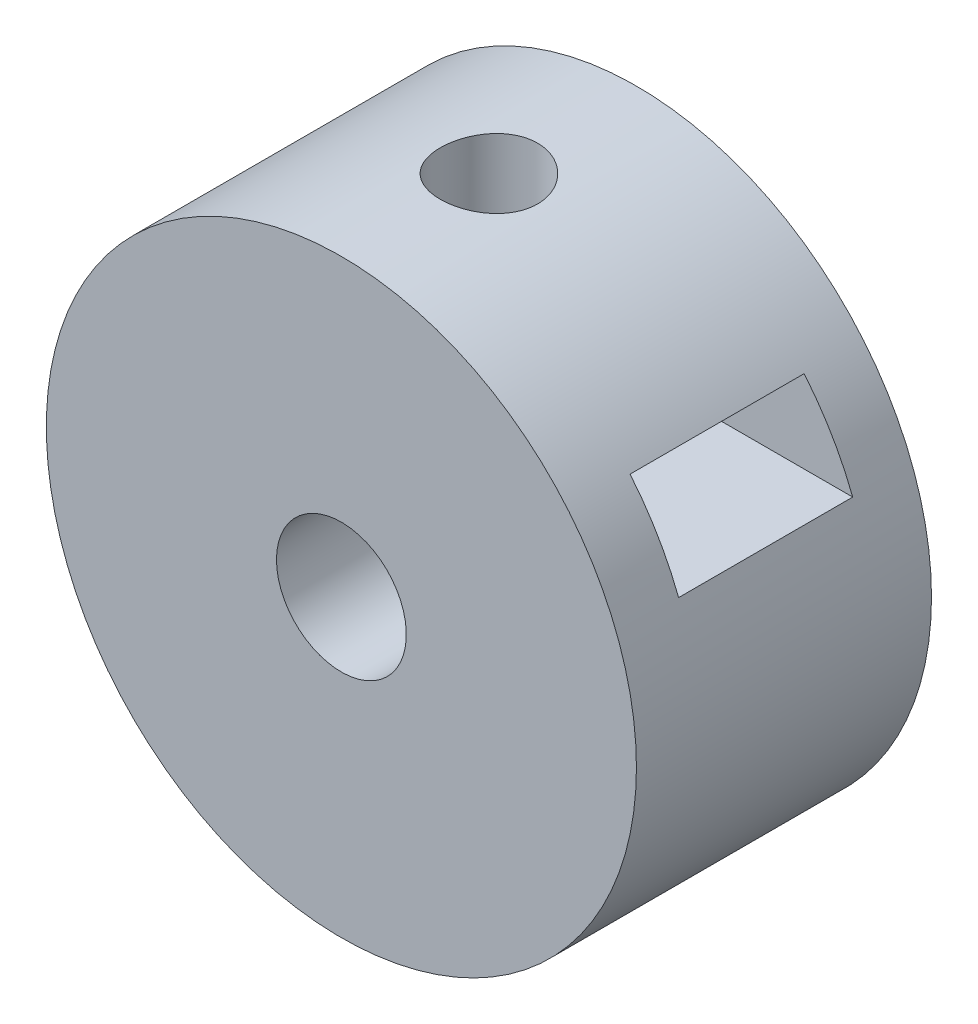
ISO-10303-21;
HEADER;
FILE_DESCRIPTION(('STEP AP214'),'2;1');
FILE_NAME('part.step','',(''),(''),'','','');
FILE_SCHEMA(('AUTOMOTIVE_DESIGN { 1 0 10303 214 1 1 1 1 }'));
ENDSEC;
DATA;
#1=APPLICATION_CONTEXT('core data for automotive mechanical design processes');
#2=APPLICATION_PROTOCOL_DEFINITION('international standard','automotive_design',2000,#1);
#3=PRODUCT_CONTEXT('',#1,'mechanical');
#4=PRODUCT('Part','Part','',(#3));
#5=PRODUCT_RELATED_PRODUCT_CATEGORY('part','',(#4));
#6=PRODUCT_DEFINITION_FORMATION('','',#4);
#7=PRODUCT_DEFINITION_CONTEXT('part definition',#1,'design');
#8=PRODUCT_DEFINITION('design','',#6,#7);
#9=PRODUCT_DEFINITION_SHAPE('','',#8);
#10=(LENGTH_UNIT() NAMED_UNIT(*) SI_UNIT(.MILLI.,.METRE.));
#11=(NAMED_UNIT(*) PLANE_ANGLE_UNIT() SI_UNIT($,.RADIAN.));
#12=(NAMED_UNIT(*) SI_UNIT($,.STERADIAN.) SOLID_ANGLE_UNIT());
#13=UNCERTAINTY_MEASURE_WITH_UNIT(LENGTH_MEASURE(1.E-05),#10,'distance_accuracy_value','');
#14=(GEOMETRIC_REPRESENTATION_CONTEXT(3) GLOBAL_UNCERTAINTY_ASSIGNED_CONTEXT((#13)) GLOBAL_UNIT_ASSIGNED_CONTEXT((#10,
#11,#12)) REPRESENTATION_CONTEXT('',''));
#15=CARTESIAN_POINT('',(0.,0.,0.));
#16=DIRECTION('',(0.,0.,1.));
#17=DIRECTION('',(1.,0.,0.));
#18=AXIS2_PLACEMENT_3D('',#15,#16,#17);
#19=CARTESIAN_POINT('',(0.,0.,5.));
#20=DIRECTION('',(0.,1.,0.));
#21=DIRECTION('',(0.,0.,1.));
#22=AXIS2_PLACEMENT_3D('',#19,#20,#21);
#23=CYLINDRICAL_SURFACE('',#22,1.65);
#24=CARTESIAN_POINT('',(0.,2.2,6.65));
#25=CARTESIAN_POINT('',(0.0805428094252697,2.19999494216035,6.64999472878678));
#26=CARTESIAN_POINT('',(0.161217168223634,2.19553010078902,6.64405447318806));
#27=CARTESIAN_POINT('',(0.320030035915114,2.17807268009191,6.62066623024883));
#28=CARTESIAN_POINT('',(0.398161649851905,2.16505866147839,6.60318931118494));
#29=CARTESIAN_POINT('',(0.549158089294374,2.13175242451666,6.55791579978785));
#30=CARTESIAN_POINT('',(0.622051776944111,2.1115044712521,6.53018193507391));
#31=CARTESIAN_POINT('',(0.761664569072828,2.06525612393863,6.46570342139405));
#32=CARTESIAN_POINT('',(0.828385471975966,2.03925741289032,6.42896140838713));
#33=CARTESIAN_POINT('',(0.960812531349159,1.98054498998381,6.3439106872501));
#34=CARTESIAN_POINT('',(1.02585255219924,1.94743239403283,6.29484593773252));
#35=CARTESIAN_POINT('',(1.14732988444438,1.87843719671715,6.18855457890271));
#36=CARTESIAN_POINT('',(1.20375363099448,1.8425503588647,6.13131536892019));
#37=CARTESIAN_POINT('',(1.31820877580285,1.76298236017189,5.9970587513938));
#38=CARTESIAN_POINT('',(1.37423636263325,1.71919940351103,5.91838595516613));
#39=CARTESIAN_POINT('',(1.47248197993983,1.63582589130548,5.7508038863968));
#40=CARTESIAN_POINT('',(1.51471888681385,1.59622965572043,5.66190883329966));
#41=CARTESIAN_POINT('',(1.57168690592967,1.53974870698196,5.50654687745614));
#42=CARTESIAN_POINT('',(1.59088241902193,1.51973526305407,5.44287023315878));
#43=CARTESIAN_POINT('',(1.62162739821328,1.48688753565754,5.31196799173659));
#44=CARTESIAN_POINT('',(1.63319436890794,1.47403682701915,5.24475090433773));
#45=CARTESIAN_POINT('',(1.6479410435559,1.45754135653008,5.10759915591616));
#46=CARTESIAN_POINT('',(1.65104450339628,1.45398029344257,5.03764551260354));
#47=CARTESIAN_POINT('',(1.64833034566056,1.45705484953675,4.89812359803027));
#48=CARTESIAN_POINT('',(1.64250952973084,1.46369412439925,4.82855547390382));
#49=CARTESIAN_POINT('',(1.6235751322107,1.48464385588771,4.69948951783163));
#50=CARTESIAN_POINT('',(1.61130735018899,1.49805872765858,4.6397099918492));
#51=CARTESIAN_POINT('',(1.58076238232806,1.53025612129433,4.52321723340704));
#52=CARTESIAN_POINT('',(1.5624794204929,1.54904380004846,4.46650700939405));
#53=CARTESIAN_POINT('',(1.50736370589788,1.60315946223737,4.32211797470244));
#54=CARTESIAN_POINT('',(1.46608163343378,1.64148214053156,4.23725954169214));
#55=CARTESIAN_POINT('',(1.37079825645971,1.72186627959715,4.07688382374401));
#56=CARTESIAN_POINT('',(1.31676604681466,1.7639366677472,4.00138992681988));
#57=CARTESIAN_POINT('',(1.19516764512349,1.84856839544459,3.85847127055598));
#58=CARTESIAN_POINT('',(1.1272951307864,1.89111545403263,3.79129733243037));
#59=CARTESIAN_POINT('',(0.979464773880551,1.9717284177907,3.66870998854072));
#60=CARTESIAN_POINT('',(0.899530559723135,2.00980283090136,3.61327408774659));
#61=CARTESIAN_POINT('',(0.74569228849956,2.07107698681007,3.52602112083563));
#62=CARTESIAN_POINT('',(0.673793857204186,2.09572848039509,3.49169694636264));
#63=CARTESIAN_POINT('',(0.523987390522299,2.13810194858642,3.43335263148975));
#64=CARTESIAN_POINT('',(0.446083155170146,2.15582826254787,3.40932603765079));
#65=CARTESIAN_POINT('',(0.285643855731874,2.18290147499588,3.37282130082492));
#66=CARTESIAN_POINT('',(0.20308340954654,2.19219652268924,3.36041460316751));
#67=CARTESIAN_POINT('',(0.0365213637766122,2.20127472025389,3.34829544289112));
#68=CARTESIAN_POINT('',(-0.0474796128099926,2.20106188329949,3.3485776244351));
#69=CARTESIAN_POINT('',(-0.205484639062585,2.19166801893461,3.36112195620051));
#70=CARTESIAN_POINT('',(-0.279644560300743,2.18339095260441,3.37217659057754));
#71=CARTESIAN_POINT('',(-0.424721737670026,2.15986452221747,3.40387115800865));
#72=CARTESIAN_POINT('',(-0.495638300285984,2.14461367457988,3.42451313065835));
#73=CARTESIAN_POINT('',(-0.635158457658743,2.10759813751645,3.47527628365241));
#74=CARTESIAN_POINT('',(-0.70359208978975,2.08562255319213,3.50570629957013));
#75=CARTESIAN_POINT('',(-0.834370379747377,2.03683683953159,3.57458970096815));
#76=CARTESIAN_POINT('',(-0.896714193470041,2.01002604145274,3.61304419640371));
#77=CARTESIAN_POINT('',(-1.02466278895094,1.94831061575149,3.70396157105162));
#78=CARTESIAN_POINT('',(-1.08907343896857,1.91280204527541,3.7576913933812));
#79=CARTESIAN_POINT('',(-1.20859172341439,1.83962848162263,3.87360962784722));
#80=CARTESIAN_POINT('',(-1.26367813516534,1.80195882358135,3.93581676966269));
#81=CARTESIAN_POINT('',(-1.37365295183189,1.72006041120646,4.08056486905729));
#82=CARTESIAN_POINT('',(-1.42651348013575,1.67594590372111,4.16472331764153));
#83=CARTESIAN_POINT('',(-1.51715559598111,1.59434650483296,4.34369608576969));
#84=CARTESIAN_POINT('',(-1.55498200567071,1.55684209528066,4.43847763409943));
#85=CARTESIAN_POINT('',(-1.60177307682444,1.50830765589441,4.59895589376192));
#86=CARTESIAN_POINT('',(-1.61624110464295,1.49265393007021,4.66163023904262));
#87=CARTESIAN_POINT('',(-1.63780674400097,1.46896261713312,4.7895777516815));
#88=CARTESIAN_POINT('',(-1.64492080719164,1.46090803342256,4.85484477748247));
#89=CARTESIAN_POINT('',(-1.65126852229971,1.4537336197143,4.98661198779246));
#90=CARTESIAN_POINT('',(-1.65046216857788,1.45465914753473,5.05311673731052));
#91=CARTESIAN_POINT('',(-1.64094572222041,1.46538093398033,5.18486252262737));
#92=CARTESIAN_POINT('',(-1.63222543027043,1.47518863973232,5.25010181668698));
#93=CARTESIAN_POINT('',(-1.60483226001695,1.5049908367755,5.39150602855188));
#94=CARTESIAN_POINT('',(-1.58440224749523,1.52674176545708,5.46694689814605));
#95=CARTESIAN_POINT('',(-1.53416589992731,1.57721259723951,5.61218833371353));
#96=CARTESIAN_POINT('',(-1.50433588027503,1.60595006161623,5.681974086242));
#97=CARTESIAN_POINT('',(-1.42448810827007,1.67768125061706,5.83877269353496));
#98=CARTESIAN_POINT('',(-1.37105696272568,1.72216223510215,5.92336374103133));
#99=CARTESIAN_POINT('',(-1.2501579031253,1.811848611994,6.08143864947532));
#100=CARTESIAN_POINT('',(-1.18267748234435,1.85705461649645,6.15491251253933));
#101=CARTESIAN_POINT('',(-1.03358985943168,1.94401887833773,6.29011502651166));
#102=CARTESIAN_POINT('',(-0.95187087771915,1.98574567082179,6.35174195131491));
#103=CARTESIAN_POINT('',(-0.775675008829828,2.06093018634906,6.45994535625988));
#104=CARTESIAN_POINT('',(-0.681229362441978,2.09440760752254,6.50655777202975));
#105=CARTESIAN_POINT('',(-0.511324319392104,2.14100375086452,6.57057936308428));
#106=CARTESIAN_POINT('',(-0.43840897625221,2.1572135474969,6.59254340451379));
#107=CARTESIAN_POINT('',(-0.28912577143204,2.18222113967261,6.62625969287264));
#108=CARTESIAN_POINT('',(-0.2127681862184,2.19103963331983,6.63804045927496));
#109=CARTESIAN_POINT('',(-0.113259640848082,2.1972001887694,6.64626516363578));
#110=CARTESIAN_POINT('',(-0.0906476405935391,2.19824837575288,6.64766390523836));
#111=CARTESIAN_POINT('',(-0.0453605785868176,2.19964904965452,6.64953214055407));
#112=CARTESIAN_POINT('',(-0.0226855072712277,2.20000142457979,6.65000148467811));
#113=CARTESIAN_POINT('',(0.,2.2,6.65));
#114=B_SPLINE_CURVE_WITH_KNOTS('',3,(#24,#25,#26,#27,#28,#29,#30,#31,#32,#33,#34,#35,#36,#37,
#38,#39,#40,#41,#42,#43,#44,#45,#46,#47,#48,#49,#50,#51,#52,#53,#54,#55,#56,#57,#58,#59,#60,#61,
#62,#63,#64,#65,#66,#67,#68,#69,#70,#71,#72,#73,#74,#75,#76,#77,#78,#79,#80,#81,#82,#83,#84,#85,
#86,#87,#88,#89,#90,#91,#92,#93,#94,#95,#96,#97,#98,#99,#100,#101,#102,#103,#104,#105,#106,#107,
#108,#109,#110,#111,#112,#113),.UNSPECIFIED.,.T.,.F.,(4,2,2,2,2,2,2,2,2,2,2,2,2,2,2,2,2,2,2,2,2,
2,2,2,2,2,2,2,2,2,2,2,2,2,2,2,2,2,2,2,2,2,2,2,4),(0.,0.241528965229246,0.483665951365568,
0.72434596693072,0.964955638734223,1.22784674449173,1.49114755245679,1.80796017476196,
2.12433731462157,2.33199470382892,2.53917392514819,2.74821346383382,2.9573279373023,
3.14409579178979,3.33104351360703,3.63494264986501,3.93958611593678,4.25189472331899,
4.5635992874306,4.81279155507028,5.06182742607429,5.31238463983588,5.56283609713275,
5.78810305713193,6.01341796204393,6.24668483432048,6.47998399375295,6.75224420290054,
7.02511599883997,7.34985455617541,7.67361755435123,7.87148077565226,8.06890039025629,
8.26731767240215,8.46599103420239,8.70803638056148,8.95069653653913,9.27753471321344,
9.60466509629982,9.93448994441914,10.2635194230048,10.4961526729579,10.7281322751158,
10.7961498356658,10.8641783429406),.UNSPECIFIED.);
#115=CARTESIAN_POINT('',(0.,2.2,6.65));
#116=VERTEX_POINT('',#115);
#117=EDGE_CURVE('E185',#116,#116,#114,.T.);
#118=ORIENTED_EDGE('',*,*,#117,.F.);
#119=EDGE_LOOP('',(#118));
#120=FACE_BOUND('',#119,.T.);
#121=CARTESIAN_POINT('',(0.,3.6,5.));
#122=DIRECTION('',(0.,1.,0.));
#123=DIRECTION('',(0.,0.,1.));
#124=AXIS2_PLACEMENT_3D('',#121,#122,#123);
#125=CIRCLE('',#124,1.65);
#126=CARTESIAN_POINT('',(0.,3.6,6.65));
#127=VERTEX_POINT('',#126);
#128=EDGE_CURVE('E172',#127,#127,#125,.T.);
#129=ORIENTED_EDGE('',*,*,#128,.T.);
#130=EDGE_LOOP('',(#129));
#131=FACE_BOUND('',#130,.T.);
#132=ADVANCED_FACE('F40',(#120,#131),#23,.F.);
#133=CARTESIAN_POINT('',(0.,0.,10.));
#134=DIRECTION('',(0.,0.,-1.));
#135=DIRECTION('',(-1.,0.,0.));
#136=AXIS2_PLACEMENT_3D('',#133,#134,#135);
#137=CYLINDRICAL_SURFACE('',#136,10.);
#138=CARTESIAN_POINT('',(0.,10.,6.65));
#139=CARTESIAN_POINT('',(-0.0920114531057516,9.99999843258099,6.64999629901469));
#140=CARTESIAN_POINT('',(-0.184073454347173,9.99871684765511,6.64227754131458));
#141=CARTESIAN_POINT('',(-0.36561632253533,9.99372775496381,6.61161876486207));
#142=CARTESIAN_POINT('',(-0.45509472135177,9.99001800272159,6.5886646630412));
#143=CARTESIAN_POINT('',(-0.628817487751616,9.98058875631552,6.52824636106409));
#144=CARTESIAN_POINT('',(-0.713066038744486,9.974870893487,6.4907939364397));
#145=CARTESIAN_POINT('',(-0.874072236504043,9.96205444853338,6.40247274585138));
#146=CARTESIAN_POINT('',(-0.95083075765333,9.95495602786423,6.35160554849499));
#147=CARTESIAN_POINT('',(-1.09540879372213,9.9400912001718,6.23739122286708));
#148=CARTESIAN_POINT('',(-1.16314787882339,9.93231968689365,6.17394293638175));
#149=CARTESIAN_POINT('',(-1.28706950777735,9.9170237472334,6.03658522640678));
#150=CARTESIAN_POINT('',(-1.34325132909589,9.90949933632427,5.96267514935682));
#151=CARTESIAN_POINT('',(-1.44278500045253,9.89550007731641,5.80594065632332));
#152=CARTESIAN_POINT('',(-1.48605749570899,9.88903182722124,5.72306520565612));
#153=CARTESIAN_POINT('',(-1.55803674048924,9.87794796970923,5.55109737476351));
#154=CARTESIAN_POINT('',(-1.58674445381556,9.87333223970889,5.46200540635072));
#155=CARTESIAN_POINT('',(-1.6285261950301,9.86652679242373,5.28098541799901));
#156=CARTESIAN_POINT('',(-1.64173895927951,9.86431555933323,5.18909024432124));
#157=CARTESIAN_POINT('',(-1.65258585530687,9.86250435770823,5.00436263407657));
#158=CARTESIAN_POINT('',(-1.6502210677036,9.86290420804218,4.91153026296937));
#159=CARTESIAN_POINT('',(-1.63009303176278,9.86625034802632,4.72855272294329));
#160=CARTESIAN_POINT('',(-1.61248549472488,9.86917088684506,4.63838988597263));
#161=CARTESIAN_POINT('',(-1.5626160736781,9.87718903199043,4.4623159294666));
#162=CARTESIAN_POINT('',(-1.53035369619838,9.88228671162733,4.37640495321172));
#163=CARTESIAN_POINT('',(-1.45193210975571,9.89411264039674,4.21080647007558));
#164=CARTESIAN_POINT('',(-1.4057081060585,9.90084846298694,4.13115021075931));
#165=CARTESIAN_POINT('',(-1.30072141548377,9.9151864393107,3.98066567609225));
#166=CARTESIAN_POINT('',(-1.24195773629987,9.92278866158316,3.90983810008771));
#167=CARTESIAN_POINT('',(-1.11271072676603,9.93811607123993,3.77812002111733));
#168=CARTESIAN_POINT('',(-1.04209376928223,9.94584163094155,3.71736060537004));
#169=CARTESIAN_POINT('',(-0.891597059898568,9.96045987838133,3.60853397839373));
#170=CARTESIAN_POINT('',(-0.811717250503359,9.9673525609492,3.56046684595291));
#171=CARTESIAN_POINT('',(-0.644840083170755,9.97953794169528,3.47837784946568));
#172=CARTESIAN_POINT('',(-0.557837003156561,9.98482933722619,3.44436741236198));
#173=CARTESIAN_POINT('',(-0.379246930002472,9.99320544362233,3.39147808722466));
#174=CARTESIAN_POINT('',(-0.287660313260822,9.99629033536768,3.37259795885521));
#175=CARTESIAN_POINT('',(-0.103632983819162,9.99988156603306,3.35068253883883));
#176=CARTESIAN_POINT('',(-0.0112142564118358,10.0004171933872,3.34746726387846));
#177=CARTESIAN_POINT('',(0.172841505554681,9.99892971175882,3.35649319868026));
#178=CARTESIAN_POINT('',(0.264478569441164,9.99690669920295,3.36873382596047));
#179=CARTESIAN_POINT('',(0.443814955541769,9.99054737820398,3.4081744027771));
#180=CARTESIAN_POINT('',(0.531534371938301,9.98622483070291,3.43528539430835));
#181=CARTESIAN_POINT('',(0.701182959294593,9.97574921956607,3.50360239255507));
#182=CARTESIAN_POINT('',(0.78311181018899,9.96959605484327,3.54480917766168));
#183=CARTESIAN_POINT('',(0.939636398877252,9.95606928426946,3.64056131949898));
#184=CARTESIAN_POINT('',(1.01416235726447,9.94868555427359,3.6952192859171));
#185=CARTESIAN_POINT('',(1.15304841333209,9.93354765732487,3.81616714906879));
#186=CARTESIAN_POINT('',(1.21740778758216,9.92579346406183,3.88245787285429));
#187=CARTESIAN_POINT('',(1.33479962911472,9.91069407401676,4.0255961063283));
#188=CARTESIAN_POINT('',(1.38771058951944,9.90335382329475,4.10254387109881));
#189=CARTESIAN_POINT('',(1.47985547415617,9.89000528724129,4.26434104706746));
#190=CARTESIAN_POINT('',(1.51908982562647,9.88399696030451,4.34919021133191));
#191=CARTESIAN_POINT('',(1.58258535747086,9.87402953570153,4.52403953240315));
#192=CARTESIAN_POINT('',(1.60690737863649,9.87006212213643,4.61401709979667));
#193=CARTESIAN_POINT('',(1.64007952798876,9.86460473721113,4.79685131178056));
#194=CARTESIAN_POINT('',(1.64893097191819,9.86311455516768,4.88970771084816));
#195=CARTESIAN_POINT('',(1.65087457438796,9.86278931217107,5.07445064130181));
#196=CARTESIAN_POINT('',(1.64415796786954,9.86392203182987,5.16633516019211));
#197=CARTESIAN_POINT('',(1.61556925478547,9.86864441177183,5.34764775186387));
#198=CARTESIAN_POINT('',(1.59369719454886,9.87223406454433,5.4370758321536));
#199=CARTESIAN_POINT('',(1.53549112071357,9.88145370519205,5.61086524243541));
#200=CARTESIAN_POINT('',(1.49917324977366,9.88708141498759,5.69523210745097));
#201=CARTESIAN_POINT('',(1.41312606218935,9.89974533231771,5.85670626686032));
#202=CARTESIAN_POINT('',(1.36339610211421,9.90678160742252,5.93381321272773));
#203=CARTESIAN_POINT('',(1.25125259966706,9.92157214136343,6.07954549763769));
#204=CARTESIAN_POINT('',(1.18869826623127,9.92933379899765,6.14806175981957));
#205=CARTESIAN_POINT('',(1.05297867490409,9.94464125601211,6.27369059987676));
#206=CARTESIAN_POINT('',(0.979810970092673,9.95218700513286,6.33080054078024));
#207=CARTESIAN_POINT('',(0.824354696103048,9.96627143049842,6.43234742257348));
#208=CARTESIAN_POINT('',(0.742007852048189,9.97280295936929,6.47669614797803));
#209=CARTESIAN_POINT('',(0.570959586923796,9.98405342047581,6.55086335280631));
#210=CARTESIAN_POINT('',(0.482264623543764,9.98877416450827,6.58069636412524));
#211=CARTESIAN_POINT('',(0.327682758240929,9.99483601455804,6.61847934152685));
#212=CARTESIAN_POINT('',(0.2627330667111,9.99676220083327,6.6302807488145));
#213=CARTESIAN_POINT('',(0.131864227625941,9.99934474465587,6.64604233893311));
#214=CARTESIAN_POINT('',(0.0659450962546689,10.0000011233775,6.65000265251579));
#215=CARTESIAN_POINT('',(0.,10.,6.65));
#216=B_SPLINE_CURVE_WITH_KNOTS('',3,(#138,#139,#140,#141,#142,#143,#144,#145,#146,#147,#148,
#149,#150,#151,#152,#153,#154,#155,#156,#157,#158,#159,#160,#161,#162,#163,#164,#165,#166,#167,
#168,#169,#170,#171,#172,#173,#174,#175,#176,#177,#178,#179,#180,#181,#182,#183,#184,#185,#186,
#187,#188,#189,#190,#191,#192,#193,#194,#195,#196,#197,#198,#199,#200,#201,#202,#203,#204,#205,
#206,#207,#208,#209,#210,#211,#212,#213,#214,#215),.UNSPECIFIED.,.T.,.F.,(4,2,2,2,2,2,2,2,2,2,2,
2,2,2,2,2,2,2,2,2,2,2,2,2,2,2,2,2,2,2,2,2,2,2,2,2,2,2,4),(0.,0.275793319008919,
0.551841928312974,0.827666799870601,1.10345943314171,1.38156673144316,1.65969141110742,
1.93949209608634,2.21927426326045,2.49653175525207,2.7737700140227,3.04820914252877,
3.32265751287873,3.59839967320043,3.87416366201708,4.15327572401922,4.43238951858749,
4.71172976565334,4.99104711092803,5.26714751096619,5.54323750600192,5.81769359979006,
6.09216485190805,6.36901711215388,6.6458890636926,6.92556925596461,7.2052407106323,
7.48376340648036,7.76226241335699,8.03735855216248,8.31245385002405,8.58724259883662,
8.8620445326932,9.14004258759621,9.41810483731135,9.69804546871321,9.97770526783285,
10.1753710978728,10.3730336317699),.UNSPECIFIED.);
#217=CARTESIAN_POINT('',(0.,10.,6.65));
#218=VERTEX_POINT('',#217);
#219=EDGE_CURVE('E194',#218,#218,#216,.T.);
#220=ORIENTED_EDGE('',*,*,#219,.T.);
#221=EDGE_LOOP('',(#220));
#222=FACE_BOUND('',#221,.T.);
#223=CARTESIAN_POINT('',(0.,0.,0.));
#224=DIRECTION('',(0.,0.,1.));
#225=DIRECTION('',(1.,0.,0.));
#226=AXIS2_PLACEMENT_3D('',#223,#224,#225);
#227=CIRCLE('',#226,10.);
#228=CARTESIAN_POINT('',(10.,0.,0.));
#229=VERTEX_POINT('',#228);
#230=EDGE_CURVE('E256',#229,#229,#227,.T.);
#231=ORIENTED_EDGE('',*,*,#230,.T.);
#232=EDGE_LOOP('',(#231));
#233=FACE_BOUND('',#232,.T.);
#234=CARTESIAN_POINT('',(0.,0.,10.));
#235=DIRECTION('',(0.,0.,1.));
#236=DIRECTION('',(1.,0.,0.));
#237=AXIS2_PLACEMENT_3D('',#234,#235,#236);
#238=CIRCLE('',#237,10.);
#239=CARTESIAN_POINT('',(10.,0.,10.));
#240=VERTEX_POINT('',#239);
#241=EDGE_CURVE('E262',#240,#240,#238,.T.);
#242=ORIENTED_EDGE('',*,*,#241,.F.);
#243=EDGE_LOOP('',(#242));
#244=FACE_BOUND('',#243,.T.);
#245=DIRECTION('',(0.,0.,-1.));
#246=VECTOR('',#245,1.);
#247=CARTESIAN_POINT('',(7.68374908491942,6.4,10.));
#248=LINE('',#247,#246);
#249=CARTESIAN_POINT('',(7.68374908491942,6.4,2.));
#250=VERTEX_POINT('',#249);
#251=CARTESIAN_POINT('',(7.68374908491942,6.4,7.9));
#252=VERTEX_POINT('',#251);
#253=EDGE_CURVE('E277',#250,#252,#248,.F.);
#254=ORIENTED_EDGE('',*,*,#253,.F.);
#255=CARTESIAN_POINT('',(0.,0.,2.));
#256=DIRECTION('',(0.,0.,1.));
#257=DIRECTION('',(1.,0.,0.));
#258=AXIS2_PLACEMENT_3D('',#255,#256,#257);
#259=CIRCLE('',#258,10.);
#260=CARTESIAN_POINT('',(9.32952303175248,3.6,2.));
#261=VERTEX_POINT('',#260);
#262=EDGE_CURVE('E65',#261,#250,#259,.T.);
#263=ORIENTED_EDGE('',*,*,#262,.F.);
#264=DIRECTION('',(0.,0.,-1.));
#265=VECTOR('',#264,1.);
#266=CARTESIAN_POINT('',(9.32952303175248,3.6,10.));
#267=LINE('',#266,#265);
#268=CARTESIAN_POINT('',(9.32952303175248,3.6,7.9));
#269=VERTEX_POINT('',#268);
#270=EDGE_CURVE('E272',#269,#261,#267,.T.);
#271=ORIENTED_EDGE('',*,*,#270,.F.);
#272=CARTESIAN_POINT('',(0.,0.,7.9));
#273=DIRECTION('',(0.,0.,-1.));
#274=DIRECTION('',(-1.,0.,0.));
#275=AXIS2_PLACEMENT_3D('',#272,#273,#274);
#276=CIRCLE('',#275,10.);
#277=EDGE_CURVE('E266',#252,#269,#276,.T.);
#278=ORIENTED_EDGE('',*,*,#277,.F.);
#279=EDGE_LOOP('',(#254,#263,#271,#278));
#280=FACE_BOUND('',#279,.T.);
#281=ADVANCED_FACE('F42',(#222,#233,#244,#280),#137,.T.);
#282=CARTESIAN_POINT('',(0.,0.,10.));
#283=DIRECTION('',(0.,0.,1.));
#284=DIRECTION('',(1.,0.,0.));
#285=AXIS2_PLACEMENT_3D('',#282,#283,#284);
#286=PLANE('',#285);
#287=CARTESIAN_POINT('',(0.,0.,10.));
#288=DIRECTION('',(0.,0.,-1.));
#289=DIRECTION('',(-1.,0.,0.));
#290=AXIS2_PLACEMENT_3D('',#287,#288,#289);
#291=CIRCLE('',#290,2.2);
#292=CARTESIAN_POINT('',(-2.2,0.,10.));
#293=VERTEX_POINT('',#292);
#294=EDGE_CURVE('E246',#293,#293,#291,.T.);
#295=ORIENTED_EDGE('',*,*,#294,.T.);
#296=EDGE_LOOP('',(#295));
#297=FACE_BOUND('',#296,.T.);
#298=ORIENTED_EDGE('',*,*,#241,.T.);
#299=EDGE_LOOP('',(#298));
#300=FACE_BOUND('',#299,.T.);
#301=ADVANCED_FACE('F234',(#297,#300),#286,.T.);
#302=CARTESIAN_POINT('',(0.,0.,0.));
#303=DIRECTION('',(0.,0.,1.));
#304=DIRECTION('',(1.,0.,0.));
#305=AXIS2_PLACEMENT_3D('',#302,#303,#304);
#306=PLANE('',#305);
#307=CARTESIAN_POINT('',(0.,0.,0.));
#308=DIRECTION('',(0.,0.,-1.));
#309=DIRECTION('',(-1.,0.,0.));
#310=AXIS2_PLACEMENT_3D('',#307,#308,#309);
#311=CIRCLE('',#310,2.2);
#312=CARTESIAN_POINT('',(-2.2,0.,0.));
#313=VERTEX_POINT('',#312);
#314=EDGE_CURVE('E249',#313,#313,#311,.T.);
#315=ORIENTED_EDGE('',*,*,#314,.F.);
#316=EDGE_LOOP('',(#315));
#317=FACE_BOUND('',#316,.T.);
#318=ORIENTED_EDGE('',*,*,#230,.F.);
#319=EDGE_LOOP('',(#318));
#320=FACE_BOUND('',#319,.T.);
#321=ADVANCED_FACE('F242',(#317,#320),#306,.F.);
#322=CARTESIAN_POINT('',(0.,0.,10.));
#323=DIRECTION('',(0.,0.,-1.));
#324=DIRECTION('',(-1.,0.,0.));
#325=AXIS2_PLACEMENT_3D('',#322,#323,#324);
#326=CYLINDRICAL_SURFACE('',#325,2.2);
#327=ORIENTED_EDGE('',*,*,#117,.T.);
#328=EDGE_LOOP('',(#327));
#329=FACE_BOUND('',#328,.T.);
#330=ORIENTED_EDGE('',*,*,#294,.F.);
#331=EDGE_LOOP('',(#330));
#332=FACE_BOUND('',#331,.T.);
#333=ORIENTED_EDGE('',*,*,#314,.T.);
#334=EDGE_LOOP('',(#333));
#335=FACE_BOUND('',#334,.T.);
#336=ADVANCED_FACE('F199',(#329,#332,#335),#326,.F.);
#337=CARTESIAN_POINT('',(10.,6.4,7.9));
#338=DIRECTION('',(0.,-1.,0.));
#339=DIRECTION('',(0.,0.,-1.));
#340=AXIS2_PLACEMENT_3D('',#337,#338,#339);
#341=PLANE('',#340);
#342=DIRECTION('',(-1.,0.,0.));
#343=VECTOR('',#342,1.);
#344=CARTESIAN_POINT('',(1.7031832941094,6.4,2.05));
#345=LINE('',#344,#343);
#346=CARTESIAN_POINT('',(0.,6.4,2.05));
#347=VERTEX_POINT('',#346);
#348=CARTESIAN_POINT('',(-1.7031832941094,6.4,2.05));
#349=VERTEX_POINT('',#348);
#350=EDGE_CURVE('E131',#347,#349,#345,.T.);
#351=ORIENTED_EDGE('',*,*,#350,.F.);
#352=DIRECTION('',(0.,0.,1.));
#353=VECTOR('',#352,1.);
#354=CARTESIAN_POINT('',(0.,6.4,7.9));
#355=LINE('',#354,#353);
#356=CARTESIAN_POINT('',(0.,6.4,2.));
#357=VERTEX_POINT('',#356);
#358=EDGE_CURVE('E298',#357,#347,#355,.T.);
#359=ORIENTED_EDGE('',*,*,#358,.F.);
#360=DIRECTION('',(-1.,0.,0.));
#361=VECTOR('',#360,1.);
#362=CARTESIAN_POINT('',(10.,6.4,2.));
#363=LINE('',#362,#361);
#364=EDGE_CURVE('E295',#250,#357,#363,.T.);
#365=ORIENTED_EDGE('',*,*,#364,.F.);
#366=ORIENTED_EDGE('',*,*,#253,.T.);
#367=DIRECTION('',(-1.,0.,0.));
#368=VECTOR('',#367,1.);
#369=CARTESIAN_POINT('',(10.,6.4,7.9));
#370=LINE('',#369,#368);
#371=CARTESIAN_POINT('',(1.73205080756888,6.4,7.9));
#372=VERTEX_POINT('',#371);
#373=EDGE_CURVE('E57',#252,#372,#370,.T.);
#374=ORIENTED_EDGE('',*,*,#373,.T.);
#375=DIRECTION('',(0.5,0.,-0.866025403784439));
#376=VECTOR('',#375,1.);
#377=CARTESIAN_POINT('',(1.7031832941094,6.4,7.95));
#378=LINE('',#377,#376);
#379=CARTESIAN_POINT('',(1.7031832941094,6.4,7.95));
#380=VERTEX_POINT('',#379);
#381=EDGE_CURVE('E125',#380,#372,#378,.T.);
#382=ORIENTED_EDGE('',*,*,#381,.F.);
#383=DIRECTION('',(1.,0.,0.));
#384=VECTOR('',#383,1.);
#385=CARTESIAN_POINT('',(-1.7031832941094,6.4,7.95));
#386=LINE('',#385,#384);
#387=CARTESIAN_POINT('',(-1.7031832941094,6.4,7.95));
#388=VERTEX_POINT('',#387);
#389=EDGE_CURVE('E163',#388,#380,#386,.T.);
#390=ORIENTED_EDGE('',*,*,#389,.F.);
#391=DIRECTION('',(0.5,0.,0.866025403784439));
#392=VECTOR('',#391,1.);
#393=CARTESIAN_POINT('',(-3.40636658821879,6.4,5.));
#394=LINE('',#393,#392);
#395=CARTESIAN_POINT('',(-3.40636658821879,6.4,5.));
#396=VERTEX_POINT('',#395);
#397=EDGE_CURVE('E159',#396,#388,#394,.T.);
#398=ORIENTED_EDGE('',*,*,#397,.F.);
#399=DIRECTION('',(-0.5,0.,0.866025403784439));
#400=VECTOR('',#399,1.);
#401=CARTESIAN_POINT('',(-1.7031832941094,6.4,2.05));
#402=LINE('',#401,#400);
#403=EDGE_CURVE('E156',#349,#396,#402,.T.);
#404=ORIENTED_EDGE('',*,*,#403,.F.);
#405=EDGE_LOOP('',(#351,#359,#365,#366,#374,#382,#390,#398,#404));
#406=FACE_BOUND('',#405,.T.);
#407=CARTESIAN_POINT('',(0.,6.4,5.));
#408=DIRECTION('',(0.,-1.,0.));
#409=DIRECTION('',(0.,0.,-1.));
#410=AXIS2_PLACEMENT_3D('',#407,#408,#409);
#411=CIRCLE('',#410,1.65);
#412=CARTESIAN_POINT('',(0.,6.4,3.35));
#413=VERTEX_POINT('',#412);
#414=EDGE_CURVE('E181',#413,#413,#411,.T.);
#415=ORIENTED_EDGE('',*,*,#414,.F.);
#416=EDGE_LOOP('',(#415));
#417=FACE_BOUND('',#416,.T.);
#418=ADVANCED_FACE('F211',(#406,#417),#341,.T.);
#419=CARTESIAN_POINT('',(10.,6.4,2.));
#420=DIRECTION('',(0.,0.,1.));
#421=DIRECTION('',(1.,0.,0.));
#422=AXIS2_PLACEMENT_3D('',#419,#420,#421);
#423=PLANE('',#422);
#424=ORIENTED_EDGE('',*,*,#262,.T.);
#425=ORIENTED_EDGE('',*,*,#364,.T.);
#426=DIRECTION('',(0.,1.,0.));
#427=VECTOR('',#426,1.);
#428=CARTESIAN_POINT('',(0.,6.4,2.));
#429=LINE('',#428,#427);
#430=CARTESIAN_POINT('',(0.,3.6,2.));
#431=VERTEX_POINT('',#430);
#432=EDGE_CURVE('E290',#431,#357,#429,.T.);
#433=ORIENTED_EDGE('',*,*,#432,.F.);
#434=DIRECTION('',(-1.,0.,0.));
#435=VECTOR('',#434,1.);
#436=CARTESIAN_POINT('',(10.,3.6,2.));
#437=LINE('',#436,#435);
#438=EDGE_CURVE('E282',#261,#431,#437,.T.);
#439=ORIENTED_EDGE('',*,*,#438,.F.);
#440=EDGE_LOOP('',(#424,#425,#433,#439));
#441=FACE_BOUND('',#440,.T.);
#442=ADVANCED_FACE('F215',(#441),#423,.T.);
#443=CARTESIAN_POINT('',(10.,3.6,7.9));
#444=DIRECTION('',(0.,1.,0.));
#445=DIRECTION('',(0.,0.,1.));
#446=AXIS2_PLACEMENT_3D('',#443,#444,#445);
#447=PLANE('',#446);
#448=ORIENTED_EDGE('',*,*,#128,.F.);
#449=EDGE_LOOP('',(#448));
#450=FACE_BOUND('',#449,.T.);
#451=DIRECTION('',(0.,0.,-1.));
#452=VECTOR('',#451,1.);
#453=CARTESIAN_POINT('',(0.,3.6,7.9));
#454=LINE('',#453,#452);
#455=CARTESIAN_POINT('',(0.,3.6,2.05));
#456=VERTEX_POINT('',#455);
#457=EDGE_CURVE('E121',#456,#431,#454,.T.);
#458=ORIENTED_EDGE('',*,*,#457,.F.);
#459=DIRECTION('',(-1.,0.,0.));
#460=VECTOR('',#459,1.);
#461=CARTESIAN_POINT('',(1.7031832941094,3.6,2.05));
#462=LINE('',#461,#460);
#463=CARTESIAN_POINT('',(-1.7031832941094,3.6,2.05));
#464=VERTEX_POINT('',#463);
#465=EDGE_CURVE('E114',#456,#464,#462,.T.);
#466=ORIENTED_EDGE('',*,*,#465,.T.);
#467=DIRECTION('',(-0.5,0.,0.866025403784439));
#468=VECTOR('',#467,1.);
#469=CARTESIAN_POINT('',(-1.7031832941094,3.6,2.05));
#470=LINE('',#469,#468);
#471=CARTESIAN_POINT('',(-3.40636658821879,3.6,5.));
#472=VERTEX_POINT('',#471);
#473=EDGE_CURVE('E119',#464,#472,#470,.T.);
#474=ORIENTED_EDGE('',*,*,#473,.T.);
#475=DIRECTION('',(0.5,0.,0.866025403784439));
#476=VECTOR('',#475,1.);
#477=CARTESIAN_POINT('',(-3.40636658821879,3.6,5.));
#478=LINE('',#477,#476);
#479=CARTESIAN_POINT('',(-1.7031832941094,3.6,7.95));
#480=VERTEX_POINT('',#479);
#481=EDGE_CURVE('E142',#472,#480,#478,.T.);
#482=ORIENTED_EDGE('',*,*,#481,.T.);
#483=DIRECTION('',(1.,0.,0.));
#484=VECTOR('',#483,1.);
#485=CARTESIAN_POINT('',(-1.7031832941094,3.6,7.95));
#486=LINE('',#485,#484);
#487=CARTESIAN_POINT('',(1.7031832941094,3.6,7.95));
#488=VERTEX_POINT('',#487);
#489=EDGE_CURVE('E145',#480,#488,#486,.T.);
#490=ORIENTED_EDGE('',*,*,#489,.T.);
#491=DIRECTION('',(0.5,0.,-0.866025403784439));
#492=VECTOR('',#491,1.);
#493=CARTESIAN_POINT('',(1.7031832941094,3.6,7.95));
#494=LINE('',#493,#492);
#495=CARTESIAN_POINT('',(1.73205080756888,3.6,7.9));
#496=VERTEX_POINT('',#495);
#497=EDGE_CURVE('E137',#488,#496,#494,.T.);
#498=ORIENTED_EDGE('',*,*,#497,.T.);
#499=DIRECTION('',(-1.,0.,0.));
#500=VECTOR('',#499,1.);
#501=CARTESIAN_POINT('',(10.,3.6,7.9));
#502=LINE('',#501,#500);
#503=EDGE_CURVE('E252',#269,#496,#502,.T.);
#504=ORIENTED_EDGE('',*,*,#503,.F.);
#505=ORIENTED_EDGE('',*,*,#270,.T.);
#506=ORIENTED_EDGE('',*,*,#438,.T.);
#507=EDGE_LOOP('',(#458,#466,#474,#482,#490,#498,#504,#505,#506));
#508=FACE_BOUND('',#507,.T.);
#509=ADVANCED_FACE('F116',(#450,#508),#447,.T.);
#510=CARTESIAN_POINT('',(10.,6.4,7.9));
#511=DIRECTION('',(0.,0.,-1.));
#512=DIRECTION('',(-1.,0.,0.));
#513=AXIS2_PLACEMENT_3D('',#510,#511,#512);
#514=PLANE('',#513);
#515=DIRECTION('',(0.,-1.,0.));
#516=VECTOR('',#515,1.);
#517=CARTESIAN_POINT('',(1.73205080756888,6.4,7.9));
#518=LINE('',#517,#516);
#519=EDGE_CURVE('E12',#372,#496,#518,.T.);
#520=ORIENTED_EDGE('',*,*,#519,.F.);
#521=ORIENTED_EDGE('',*,*,#373,.F.);
#522=ORIENTED_EDGE('',*,*,#277,.T.);
#523=ORIENTED_EDGE('',*,*,#503,.T.);
#524=EDGE_LOOP('',(#520,#521,#522,#523));
#525=FACE_BOUND('',#524,.T.);
#526=ADVANCED_FACE('F221',(#525),#514,.T.);
#527=CARTESIAN_POINT('',(0.,0.,0.));
#528=DIRECTION('',(-1.,0.,0.));
#529=DIRECTION('',(0.,0.,1.));
#530=AXIS2_PLACEMENT_3D('',#527,#528,#529);
#531=PLANE('',#530);
#532=ORIENTED_EDGE('',*,*,#358,.T.);
#533=DIRECTION('',(0.,-1.,0.));
#534=VECTOR('',#533,1.);
#535=CARTESIAN_POINT('',(0.,0.,2.05));
#536=LINE('',#535,#534);
#537=EDGE_CURVE('E50',#347,#456,#536,.T.);
#538=ORIENTED_EDGE('',*,*,#537,.T.);
#539=ORIENTED_EDGE('',*,*,#457,.T.);
#540=ORIENTED_EDGE('',*,*,#432,.T.);
#541=EDGE_LOOP('',(#532,#538,#539,#540));
#542=FACE_BOUND('',#541,.T.);
#543=ADVANCED_FACE('F208',(#542),#531,.F.);
#544=ORIENTED_EDGE('',*,*,#414,.T.);
#545=EDGE_LOOP('',(#544));
#546=FACE_BOUND('',#545,.T.);
#547=ORIENTED_EDGE('',*,*,#219,.F.);
#548=EDGE_LOOP('',(#547));
#549=FACE_BOUND('',#548,.T.);
#550=ADVANCED_FACE('F203',(#546,#549),#23,.F.);
#551=CARTESIAN_POINT('',(1.7031832941094,3.6,2.05));
#552=DIRECTION('',(0.,0.,-1.));
#553=DIRECTION('',(-1.,0.,0.));
#554=AXIS2_PLACEMENT_3D('',#551,#552,#553);
#555=PLANE('',#554);
#556=ORIENTED_EDGE('',*,*,#350,.T.);
#557=DIRECTION('',(0.,1.,0.));
#558=VECTOR('',#557,1.);
#559=CARTESIAN_POINT('',(-1.7031832941094,3.6,2.05));
#560=LINE('',#559,#558);
#561=EDGE_CURVE('E128',#464,#349,#560,.T.);
#562=ORIENTED_EDGE('',*,*,#561,.F.);
#563=ORIENTED_EDGE('',*,*,#465,.F.);
#564=ORIENTED_EDGE('',*,*,#537,.F.);
#565=EDGE_LOOP('',(#556,#562,#563,#564));
#566=FACE_BOUND('',#565,.T.);
#567=ADVANCED_FACE('F129',(#566),#555,.F.);
#568=CARTESIAN_POINT('',(1.7031832941094,3.6,7.95));
#569=DIRECTION('',(0.866025403784439,0.,0.5));
#570=DIRECTION('',(0.5,0.,-0.866025403784439));
#571=AXIS2_PLACEMENT_3D('',#568,#569,#570);
#572=PLANE('',#571);
#573=ORIENTED_EDGE('',*,*,#519,.T.);
#574=ORIENTED_EDGE('',*,*,#497,.F.);
#575=DIRECTION('',(0.,1.,0.));
#576=VECTOR('',#575,1.);
#577=CARTESIAN_POINT('',(1.7031832941094,3.6,7.95));
#578=LINE('',#577,#576);
#579=EDGE_CURVE('E169',#488,#380,#578,.T.);
#580=ORIENTED_EDGE('',*,*,#579,.T.);
#581=ORIENTED_EDGE('',*,*,#381,.T.);
#582=EDGE_LOOP('',(#573,#574,#580,#581));
#583=FACE_BOUND('',#582,.T.);
#584=ADVANCED_FACE('F327',(#583),#572,.F.);
#585=CARTESIAN_POINT('',(-1.7031832941094,3.6,7.95));
#586=DIRECTION('',(0.,0.,1.));
#587=DIRECTION('',(1.,0.,0.));
#588=AXIS2_PLACEMENT_3D('',#585,#586,#587);
#589=PLANE('',#588);
#590=ORIENTED_EDGE('',*,*,#389,.T.);
#591=ORIENTED_EDGE('',*,*,#579,.F.);
#592=ORIENTED_EDGE('',*,*,#489,.F.);
#593=DIRECTION('',(0.,1.,0.));
#594=VECTOR('',#593,1.);
#595=CARTESIAN_POINT('',(-1.7031832941094,3.6,7.95));
#596=LINE('',#595,#594);
#597=EDGE_CURVE('E173',#480,#388,#596,.T.);
#598=ORIENTED_EDGE('',*,*,#597,.T.);
#599=EDGE_LOOP('',(#590,#591,#592,#598));
#600=FACE_BOUND('',#599,.T.);
#601=ADVANCED_FACE('F331',(#600),#589,.F.);
#602=CARTESIAN_POINT('',(-3.40636658821879,3.6,5.));
#603=DIRECTION('',(-0.866025403784439,0.,0.5));
#604=DIRECTION('',(0.5,0.,0.866025403784439));
#605=AXIS2_PLACEMENT_3D('',#602,#603,#604);
#606=PLANE('',#605);
#607=ORIENTED_EDGE('',*,*,#397,.T.);
#608=ORIENTED_EDGE('',*,*,#597,.F.);
#609=ORIENTED_EDGE('',*,*,#481,.F.);
#610=DIRECTION('',(0.,1.,0.));
#611=VECTOR('',#610,1.);
#612=CARTESIAN_POINT('',(-3.40636658821879,3.6,5.));
#613=LINE('',#612,#611);
#614=EDGE_CURVE('E136',#472,#396,#613,.T.);
#615=ORIENTED_EDGE('',*,*,#614,.T.);
#616=EDGE_LOOP('',(#607,#608,#609,#615));
#617=FACE_BOUND('',#616,.T.);
#618=ADVANCED_FACE('F334',(#617),#606,.F.);
#619=CARTESIAN_POINT('',(-1.7031832941094,3.6,2.05));
#620=DIRECTION('',(-0.866025403784439,0.,-0.5));
#621=DIRECTION('',(-0.5,0.,0.866025403784439));
#622=AXIS2_PLACEMENT_3D('',#619,#620,#621);
#623=PLANE('',#622);
#624=ORIENTED_EDGE('',*,*,#403,.T.);
#625=ORIENTED_EDGE('',*,*,#614,.F.);
#626=ORIENTED_EDGE('',*,*,#473,.F.);
#627=ORIENTED_EDGE('',*,*,#561,.T.);
#628=EDGE_LOOP('',(#624,#625,#626,#627));
#629=FACE_BOUND('',#628,.T.);
#630=ADVANCED_FACE('F139',(#629),#623,.F.);
#631=CLOSED_SHELL('',(#132,#281,#301,#321,#336,#418,#442,#509,#526,#543,#550,#567,#584,#601,
#618,#630));
#632=MANIFOLD_SOLID_BREP('B2',#631);
#633=ADVANCED_BREP_SHAPE_REPRESENTATION('',(#18,#632),#14);
#634=SHAPE_DEFINITION_REPRESENTATION(#9,#633);
ENDSEC;
END-ISO-10303-21;
